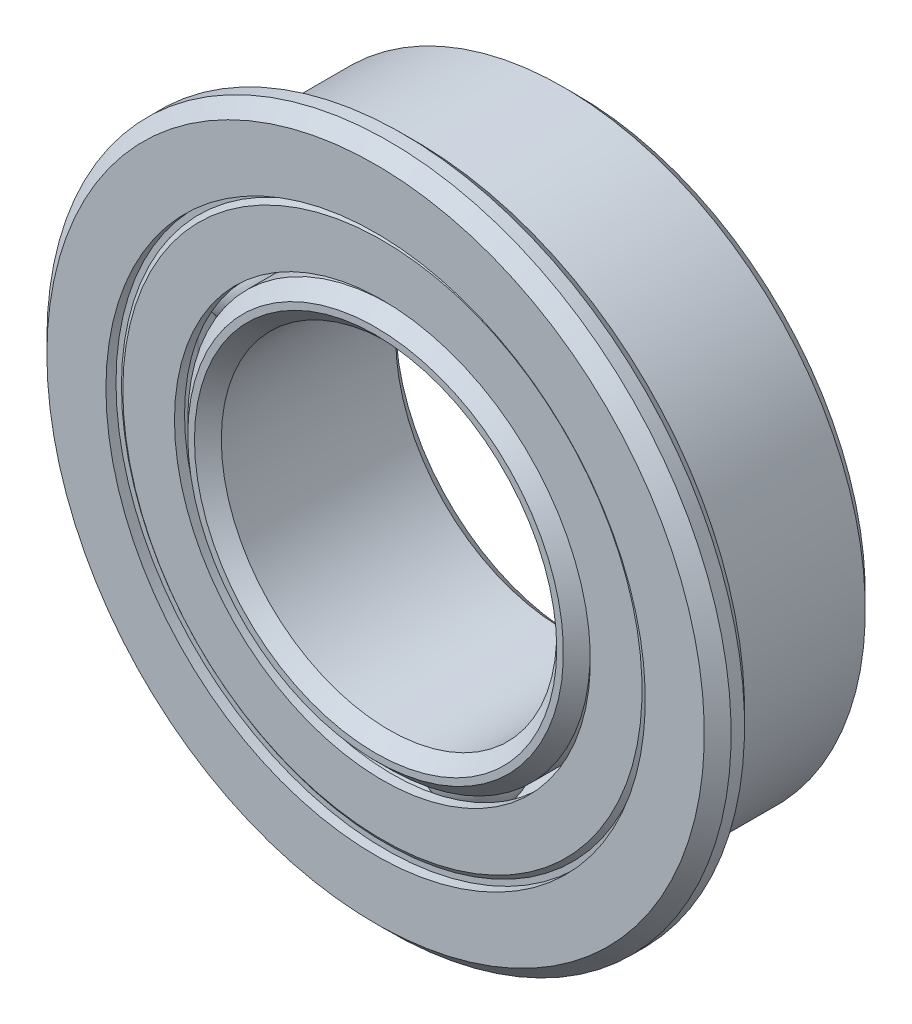
ISO-10303-21;
HEADER;
FILE_DESCRIPTION(('STEP AP214'),'2;1');
FILE_NAME('part.step','',(''),(''),'','','');
FILE_SCHEMA(('AUTOMOTIVE_DESIGN { 1 0 10303 214 1 1 1 1 }'));
ENDSEC;
DATA;
#1=APPLICATION_CONTEXT('core data for automotive mechanical design processes');
#2=APPLICATION_PROTOCOL_DEFINITION('international standard','automotive_design',2000,#1);
#3=PRODUCT_CONTEXT('',#1,'mechanical');
#4=PRODUCT('Part','Part','',(#3));
#5=PRODUCT_RELATED_PRODUCT_CATEGORY('part','',(#4));
#6=PRODUCT_DEFINITION_FORMATION('','',#4);
#7=PRODUCT_DEFINITION_CONTEXT('part definition',#1,'design');
#8=PRODUCT_DEFINITION('design','',#6,#7);
#9=PRODUCT_DEFINITION_SHAPE('','',#8);
#10=(LENGTH_UNIT() NAMED_UNIT(*) SI_UNIT(.MILLI.,.METRE.));
#11=(NAMED_UNIT(*) PLANE_ANGLE_UNIT() SI_UNIT($,.RADIAN.));
#12=(NAMED_UNIT(*) SI_UNIT($,.STERADIAN.) SOLID_ANGLE_UNIT());
#13=UNCERTAINTY_MEASURE_WITH_UNIT(LENGTH_MEASURE(1.E-05),#10,'distance_accuracy_value','');
#14=(GEOMETRIC_REPRESENTATION_CONTEXT(3) GLOBAL_UNCERTAINTY_ASSIGNED_CONTEXT((#13)) GLOBAL_UNIT_ASSIGNED_CONTEXT((#10,
#11,#12)) REPRESENTATION_CONTEXT('',''));
#15=CARTESIAN_POINT('',(0.,0.,0.));
#16=DIRECTION('',(0.,0.,1.));
#17=DIRECTION('',(1.,0.,0.));
#18=AXIS2_PLACEMENT_3D('',#15,#16,#17);
#19=CARTESIAN_POINT('',(0.,3.51,0.));
#20=DIRECTION('',(0.,0.,1.));
#21=DIRECTION('',(0.,1.,0.));
#22=AXIS2_PLACEMENT_3D('',#19,#20,#21);
#23=SPHERICAL_SURFACE('',#22,0.5955);
#24=CARTESIAN_POINT('',(0.,3.51,0.5955));
#25=VERTEX_POINT('',#24);
#26=VERTEX_LOOP('',#25);
#27=FACE_BOUND('',#26,.T.);
#28=ADVANCED_FACE('P0_F13',(#27),#23,.T.);
#29=CLOSED_SHELL('',(#28));
#30=MANIFOLD_SOLID_BREP('P0_B1',#29);
#31=CARTESIAN_POINT('',(2.06312623554658,2.83964965025607,0.));
#32=DIRECTION('',(0.,0.,1.));
#33=DIRECTION('',(0.587785252292474,0.809016994374947,0.));
#34=AXIS2_PLACEMENT_3D('',#31,#32,#33);
#35=SPHERICAL_SURFACE('',#34,0.5955);
#36=CARTESIAN_POINT('',(2.06312623554658,2.83964965025607,0.5955));
#37=VERTEX_POINT('',#36);
#38=VERTEX_LOOP('',#37);
#39=FACE_BOUND('',#38,.T.);
#40=ADVANCED_FACE('P1_F13',(#39),#35,.T.);
#41=CLOSED_SHELL('',(#40));
#42=MANIFOLD_SOLID_BREP('P1_B1',#41);
#43=CARTESIAN_POINT('',(3.33820837219599,1.08464965025606,0.));
#44=DIRECTION('',(0.,0.,1.));
#45=DIRECTION('',(0.951056516295155,0.309016994374945,0.));
#46=AXIS2_PLACEMENT_3D('',#43,#44,#45);
#47=SPHERICAL_SURFACE('',#46,0.5955);
#48=CARTESIAN_POINT('',(3.33820837219599,1.08464965025606,0.5955));
#49=VERTEX_POINT('',#48);
#50=VERTEX_LOOP('',#49);
#51=FACE_BOUND('',#50,.T.);
#52=ADVANCED_FACE('P2_F13',(#51),#47,.T.);
#53=CLOSED_SHELL('',(#52));
#54=MANIFOLD_SOLID_BREP('P2_B1',#53);
#55=CARTESIAN_POINT('',(3.33820837219598,-1.08464965025608,0.));
#56=DIRECTION('',(0.,0.,1.));
#57=DIRECTION('',(0.951056516295152,-0.309016994374952,0.));
#58=AXIS2_PLACEMENT_3D('',#55,#56,#57);
#59=SPHERICAL_SURFACE('',#58,0.5955);
#60=CARTESIAN_POINT('',(3.33820837219598,-1.08464965025608,0.5955));
#61=VERTEX_POINT('',#60);
#62=VERTEX_LOOP('',#61);
#63=FACE_BOUND('',#62,.T.);
#64=ADVANCED_FACE('P3_F13',(#63),#59,.T.);
#65=CLOSED_SHELL('',(#64));
#66=MANIFOLD_SOLID_BREP('P3_B1',#65);
#67=CARTESIAN_POINT('',(2.06312623554656,-2.83964965025608,0.));
#68=DIRECTION('',(0.,0.,1.));
#69=DIRECTION('',(0.587785252292469,-0.809016994374951,0.));
#70=AXIS2_PLACEMENT_3D('',#67,#68,#69);
#71=SPHERICAL_SURFACE('',#70,0.5955);
#72=CARTESIAN_POINT('',(2.06312623554656,-2.83964965025608,0.5955));
#73=VERTEX_POINT('',#72);
#74=VERTEX_LOOP('',#73);
#75=FACE_BOUND('',#74,.T.);
#76=ADVANCED_FACE('P4_F13',(#75),#71,.T.);
#77=CLOSED_SHELL('',(#76));
#78=MANIFOLD_SOLID_BREP('P4_B1',#77);
#79=CARTESIAN_POINT('',(0.,0.,0.));
#80=DIRECTION('',(0.,0.,-1.));
#81=DIRECTION('',(-1.,0.,0.));
#82=AXIS2_PLACEMENT_3D('',#79,#80,#81);
#83=TOROIDAL_SURFACE('',#82,3.51,0.526873164408158);
#84=CARTESIAN_POINT('',(0.,0.,0.132269918626526));
#85=DIRECTION('',(0.,0.,-1.));
#86=DIRECTION('',(-1.,0.,0.));
#87=AXIS2_PLACEMENT_3D('',#84,#85,#86);
#88=CIRCLE('',#87,3.);
#89=CARTESIAN_POINT('',(-3.,0.,0.132269918626526));
#90=VERTEX_POINT('',#89);
#91=EDGE_CURVE('P5_E10',#90,#90,#88,.T.);
#92=ORIENTED_EDGE('',*,*,#91,.T.);
#93=EDGE_LOOP('',(#92));
#94=FACE_BOUND('',#93,.T.);
#95=CARTESIAN_POINT('',(0.,0.,-0.132269918626526));
#96=DIRECTION('',(0.,0.,-1.));
#97=DIRECTION('',(-1.,0.,0.));
#98=AXIS2_PLACEMENT_3D('',#95,#96,#97);
#99=CIRCLE('',#98,3.);
#100=CARTESIAN_POINT('',(-3.,0.,-0.132269918626526));
#101=VERTEX_POINT('',#100);
#102=EDGE_CURVE('P5_E49',#101,#101,#99,.T.);
#103=ORIENTED_EDGE('',*,*,#102,.F.);
#104=EDGE_LOOP('',(#103));
#105=FACE_BOUND('',#104,.T.);
#106=ADVANCED_FACE('P5_F15',(#94,#105),#83,.F.);
#107=CARTESIAN_POINT('',(0.,0.,0.));
#108=DIRECTION('',(0.,0.,-1.));
#109=DIRECTION('',(-1.,0.,0.));
#110=AXIS2_PLACEMENT_3D('',#107,#108,#109);
#111=CYLINDRICAL_SURFACE('',#110,3.);
#112=CARTESIAN_POINT('',(0.,0.,1.3));
#113=DIRECTION('',(0.,0.,-1.));
#114=DIRECTION('',(-1.,0.,0.));
#115=AXIS2_PLACEMENT_3D('',#112,#113,#114);
#116=CIRCLE('',#115,3.);
#117=CARTESIAN_POINT('',(-3.,0.,1.3));
#118=VERTEX_POINT('',#117);
#119=EDGE_CURVE('P5_E21',#118,#118,#116,.T.);
#120=ORIENTED_EDGE('',*,*,#119,.T.);
#121=EDGE_LOOP('',(#120));
#122=FACE_BOUND('',#121,.T.);
#123=ORIENTED_EDGE('',*,*,#91,.F.);
#124=EDGE_LOOP('',(#123));
#125=FACE_BOUND('',#124,.T.);
#126=ADVANCED_FACE('P5_F57',(#122,#125),#111,.T.);
#127=CARTESIAN_POINT('',(0.,0.,1.3));
#128=DIRECTION('',(0.,0.,-1.));
#129=DIRECTION('',(-1.,0.,0.));
#130=AXIS2_PLACEMENT_3D('',#127,#128,#129);
#131=CONICAL_SURFACE('',#130,3.,0.785398163397449);
#132=CARTESIAN_POINT('',(0.,0.,1.5));
#133=DIRECTION('',(0.,0.,-1.));
#134=DIRECTION('',(-1.,0.,0.));
#135=AXIS2_PLACEMENT_3D('',#132,#133,#134);
#136=CIRCLE('',#135,2.8);
#137=CARTESIAN_POINT('',(-2.8,0.,1.5));
#138=VERTEX_POINT('',#137);
#139=EDGE_CURVE('P5_E25',#138,#138,#136,.T.);
#140=ORIENTED_EDGE('',*,*,#139,.T.);
#141=EDGE_LOOP('',(#140));
#142=FACE_BOUND('',#141,.T.);
#143=ORIENTED_EDGE('',*,*,#119,.F.);
#144=EDGE_LOOP('',(#143));
#145=FACE_BOUND('',#144,.T.);
#146=ADVANCED_FACE('P5_F63',(#142,#145),#131,.T.);
#147=CARTESIAN_POINT('',(0.,2.7,1.5));
#148=DIRECTION('',(0.,0.,1.));
#149=DIRECTION('',(1.,0.,0.));
#150=AXIS2_PLACEMENT_3D('',#147,#148,#149);
#151=PLANE('',#150);
#152=CARTESIAN_POINT('',(0.,0.,1.5));
#153=DIRECTION('',(0.,0.,-1.));
#154=DIRECTION('',(-1.,0.,0.));
#155=AXIS2_PLACEMENT_3D('',#152,#153,#154);
#156=CIRCLE('',#155,2.7);
#157=CARTESIAN_POINT('',(-2.7,0.,1.5));
#158=VERTEX_POINT('',#157);
#159=EDGE_CURVE('P5_E29',#158,#158,#156,.T.);
#160=ORIENTED_EDGE('',*,*,#159,.T.);
#161=EDGE_LOOP('',(#160));
#162=FACE_BOUND('',#161,.T.);
#163=ORIENTED_EDGE('',*,*,#139,.F.);
#164=EDGE_LOOP('',(#163));
#165=FACE_BOUND('',#164,.T.);
#166=ADVANCED_FACE('P5_F68',(#162,#165),#151,.T.);
#167=CARTESIAN_POINT('',(0.,0.,1.5));
#168=DIRECTION('',(0.,0.,1.));
#169=DIRECTION('',(1.,0.,0.));
#170=AXIS2_PLACEMENT_3D('',#167,#168,#169);
#171=CONICAL_SURFACE('',#170,2.7,0.785398163397449);
#172=CARTESIAN_POINT('',(0.,0.,1.3));
#173=DIRECTION('',(0.,0.,-1.));
#174=DIRECTION('',(-1.,0.,0.));
#175=AXIS2_PLACEMENT_3D('',#172,#173,#174);
#176=CIRCLE('',#175,2.5);
#177=CARTESIAN_POINT('',(-2.5,0.,1.3));
#178=VERTEX_POINT('',#177);
#179=EDGE_CURVE('P5_E34',#178,#178,#176,.T.);
#180=ORIENTED_EDGE('',*,*,#179,.T.);
#181=EDGE_LOOP('',(#180));
#182=FACE_BOUND('',#181,.T.);
#183=ORIENTED_EDGE('',*,*,#159,.F.);
#184=EDGE_LOOP('',(#183));
#185=FACE_BOUND('',#184,.T.);
#186=ADVANCED_FACE('P5_F75',(#182,#185),#171,.F.);
#187=CARTESIAN_POINT('',(0.,0.,0.));
#188=DIRECTION('',(0.,0.,-1.));
#189=DIRECTION('',(-1.,0.,0.));
#190=AXIS2_PLACEMENT_3D('',#187,#188,#189);
#191=CYLINDRICAL_SURFACE('',#190,2.5);
#192=CARTESIAN_POINT('',(0.,0.,-1.3));
#193=DIRECTION('',(0.,0.,-1.));
#194=DIRECTION('',(-1.,0.,0.));
#195=AXIS2_PLACEMENT_3D('',#192,#193,#194);
#196=CIRCLE('',#195,2.5);
#197=CARTESIAN_POINT('',(-2.5,0.,-1.3));
#198=VERTEX_POINT('',#197);
#199=EDGE_CURVE('P5_E37',#198,#198,#196,.T.);
#200=ORIENTED_EDGE('',*,*,#199,.T.);
#201=EDGE_LOOP('',(#200));
#202=FACE_BOUND('',#201,.T.);
#203=ORIENTED_EDGE('',*,*,#179,.F.);
#204=EDGE_LOOP('',(#203));
#205=FACE_BOUND('',#204,.T.);
#206=ADVANCED_FACE('P5_F79',(#202,#205),#191,.F.);
#207=CARTESIAN_POINT('',(0.,0.,-1.3));
#208=DIRECTION('',(0.,0.,-1.));
#209=DIRECTION('',(-1.,0.,0.));
#210=AXIS2_PLACEMENT_3D('',#207,#208,#209);
#211=CONICAL_SURFACE('',#210,2.5,0.785398163397452);
#212=CARTESIAN_POINT('',(0.,0.,-1.5));
#213=DIRECTION('',(0.,0.,-1.));
#214=DIRECTION('',(-1.,0.,0.));
#215=AXIS2_PLACEMENT_3D('',#212,#213,#214);
#216=CIRCLE('',#215,2.7);
#217=CARTESIAN_POINT('',(-2.7,0.,-1.5));
#218=VERTEX_POINT('',#217);
#219=EDGE_CURVE('P5_E40',#218,#218,#216,.T.);
#220=ORIENTED_EDGE('',*,*,#219,.T.);
#221=EDGE_LOOP('',(#220));
#222=FACE_BOUND('',#221,.T.);
#223=ORIENTED_EDGE('',*,*,#199,.F.);
#224=EDGE_LOOP('',(#223));
#225=FACE_BOUND('',#224,.T.);
#226=ADVANCED_FACE('P5_F83',(#222,#225),#211,.F.);
#227=CARTESIAN_POINT('',(0.,2.8,-1.5));
#228=DIRECTION('',(0.,0.,-1.));
#229=DIRECTION('',(-1.,0.,0.));
#230=AXIS2_PLACEMENT_3D('',#227,#228,#229);
#231=PLANE('',#230);
#232=CARTESIAN_POINT('',(0.,0.,-1.5));
#233=DIRECTION('',(0.,0.,-1.));
#234=DIRECTION('',(-1.,0.,0.));
#235=AXIS2_PLACEMENT_3D('',#232,#233,#234);
#236=CIRCLE('',#235,2.8);
#237=CARTESIAN_POINT('',(-2.8,0.,-1.5));
#238=VERTEX_POINT('',#237);
#239=EDGE_CURVE('P5_E43',#238,#238,#236,.T.);
#240=ORIENTED_EDGE('',*,*,#239,.T.);
#241=EDGE_LOOP('',(#240));
#242=FACE_BOUND('',#241,.T.);
#243=ORIENTED_EDGE('',*,*,#219,.F.);
#244=EDGE_LOOP('',(#243));
#245=FACE_BOUND('',#244,.T.);
#246=ADVANCED_FACE('P5_F87',(#242,#245),#231,.T.);
#247=CARTESIAN_POINT('',(0.,0.,-1.5));
#248=DIRECTION('',(0.,0.,1.));
#249=DIRECTION('',(1.,0.,0.));
#250=AXIS2_PLACEMENT_3D('',#247,#248,#249);
#251=CONICAL_SURFACE('',#250,2.8,0.785398163397449);
#252=CARTESIAN_POINT('',(0.,0.,-1.3));
#253=DIRECTION('',(0.,0.,-1.));
#254=DIRECTION('',(-1.,0.,0.));
#255=AXIS2_PLACEMENT_3D('',#252,#253,#254);
#256=CIRCLE('',#255,3.);
#257=CARTESIAN_POINT('',(-3.,0.,-1.3));
#258=VERTEX_POINT('',#257);
#259=EDGE_CURVE('P5_E46',#258,#258,#256,.T.);
#260=ORIENTED_EDGE('',*,*,#259,.T.);
#261=EDGE_LOOP('',(#260));
#262=FACE_BOUND('',#261,.T.);
#263=ORIENTED_EDGE('',*,*,#239,.F.);
#264=EDGE_LOOP('',(#263));
#265=FACE_BOUND('',#264,.T.);
#266=ADVANCED_FACE('P5_F91',(#262,#265),#251,.T.);
#267=CARTESIAN_POINT('',(0.,0.,0.));
#268=DIRECTION('',(0.,0.,-1.));
#269=DIRECTION('',(-1.,0.,0.));
#270=AXIS2_PLACEMENT_3D('',#267,#268,#269);
#271=CYLINDRICAL_SURFACE('',#270,3.);
#272=ORIENTED_EDGE('',*,*,#102,.T.);
#273=EDGE_LOOP('',(#272));
#274=FACE_BOUND('',#273,.T.);
#275=ORIENTED_EDGE('',*,*,#259,.F.);
#276=EDGE_LOOP('',(#275));
#277=FACE_BOUND('',#276,.T.);
#278=ADVANCED_FACE('P5_F53',(#274,#277),#271,.T.);
#279=CLOSED_SHELL('',(#106,#126,#146,#166,#186,#206,#226,#246,#266,#278));
#280=MANIFOLD_SOLID_BREP('P5_B1',#279);
#281=CARTESIAN_POINT('',(0.,-3.51,0.));
#282=DIRECTION('',(0.,0.,1.));
#283=DIRECTION('',(0.,-1.,0.));
#284=AXIS2_PLACEMENT_3D('',#281,#282,#283);
#285=SPHERICAL_SURFACE('',#284,0.5955);
#286=CARTESIAN_POINT('',(0.,-3.51,0.5955));
#287=VERTEX_POINT('',#286);
#288=VERTEX_LOOP('',#287);
#289=FACE_BOUND('',#288,.T.);
#290=ADVANCED_FACE('P6_F13',(#289),#285,.T.);
#291=CLOSED_SHELL('',(#290));
#292=MANIFOLD_SOLID_BREP('P6_B1',#291);
#293=CARTESIAN_POINT('',(0.,4.02,-1.35));
#294=DIRECTION('',(0.,0.,-1.));
#295=DIRECTION('',(-1.,0.,0.));
#296=AXIS2_PLACEMENT_3D('',#293,#294,#295);
#297=PLANE('',#296);
#298=CARTESIAN_POINT('',(0.,0.,-1.35));
#299=DIRECTION('',(0.,0.,-1.));
#300=DIRECTION('',(-1.,0.,0.));
#301=AXIS2_PLACEMENT_3D('',#298,#299,#300);
#302=CIRCLE('',#301,4.02);
#303=CARTESIAN_POINT('',(-4.02,0.,-1.35));
#304=VERTEX_POINT('',#303);
#305=EDGE_CURVE('P7_E43',#304,#304,#302,.T.);
#306=ORIENTED_EDGE('',*,*,#305,.T.);
#307=EDGE_LOOP('',(#306));
#308=FACE_BOUND('',#307,.T.);
#309=CARTESIAN_POINT('',(0.,0.,-1.35));
#310=DIRECTION('',(0.,0.,-1.));
#311=DIRECTION('',(-1.,0.,0.));
#312=AXIS2_PLACEMENT_3D('',#309,#310,#311);
#313=CIRCLE('',#312,3.93874355173164);
#314=CARTESIAN_POINT('',(-3.93874355173164,0.,-1.35));
#315=VERTEX_POINT('',#314);
#316=EDGE_CURVE('P7_E10',#315,#315,#313,.T.);
#317=ORIENTED_EDGE('',*,*,#316,.F.);
#318=EDGE_LOOP('',(#317));
#319=FACE_BOUND('',#318,.T.);
#320=ADVANCED_FACE('P7_F15',(#308,#319),#297,.T.);
#321=CARTESIAN_POINT('',(0.,0.,-1.3981347531258));
#322=DIRECTION('',(0.,0.,1.));
#323=DIRECTION('',(1.,0.,0.));
#324=AXIS2_PLACEMENT_3D('',#321,#322,#323);
#325=CONICAL_SURFACE('',#324,3.87,0.95993108859688);
#326=ORIENTED_EDGE('',*,*,#316,.T.);
#327=EDGE_LOOP('',(#326));
#328=FACE_BOUND('',#327,.T.);
#329=CARTESIAN_POINT('',(0.,0.,-1.3981347531258));
#330=DIRECTION('',(0.,0.,-1.));
#331=DIRECTION('',(-1.,0.,0.));
#332=AXIS2_PLACEMENT_3D('',#329,#330,#331);
#333=CIRCLE('',#332,3.87);
#334=CARTESIAN_POINT('',(-3.87,0.,-1.3981347531258));
#335=VERTEX_POINT('',#334);
#336=EDGE_CURVE('P7_E21',#335,#335,#333,.T.);
#337=ORIENTED_EDGE('',*,*,#336,.F.);
#338=EDGE_LOOP('',(#337));
#339=FACE_BOUND('',#338,.T.);
#340=ADVANCED_FACE('P7_F63',(#328,#339),#325,.T.);
#341=CARTESIAN_POINT('',(0.,3.87,-1.3981347531258));
#342=DIRECTION('',(0.,0.,-1.));
#343=DIRECTION('',(-1.,0.,0.));
#344=AXIS2_PLACEMENT_3D('',#341,#342,#343);
#345=PLANE('',#344);
#346=ORIENTED_EDGE('',*,*,#336,.T.);
#347=EDGE_LOOP('',(#346));
#348=FACE_BOUND('',#347,.T.);
#349=CARTESIAN_POINT('',(0.,0.,-1.3981347531258));
#350=DIRECTION('',(0.,0.,-1.));
#351=DIRECTION('',(-1.,0.,0.));
#352=AXIS2_PLACEMENT_3D('',#349,#350,#351);
#353=CIRCLE('',#352,3.1);
#354=CARTESIAN_POINT('',(-3.1,0.,-1.3981347531258));
#355=VERTEX_POINT('',#354);
#356=EDGE_CURVE('P7_E25',#355,#355,#353,.T.);
#357=ORIENTED_EDGE('',*,*,#356,.F.);
#358=EDGE_LOOP('',(#357));
#359=FACE_BOUND('',#358,.T.);
#360=ADVANCED_FACE('P7_F68',(#348,#359),#345,.T.);
#361=CARTESIAN_POINT('',(0.,0.,0.));
#362=DIRECTION('',(0.,0.,-1.));
#363=DIRECTION('',(-1.,0.,0.));
#364=AXIS2_PLACEMENT_3D('',#361,#362,#363);
#365=CYLINDRICAL_SURFACE('',#364,3.1);
#366=ORIENTED_EDGE('',*,*,#356,.T.);
#367=EDGE_LOOP('',(#366));
#368=FACE_BOUND('',#367,.T.);
#369=CARTESIAN_POINT('',(0.,0.,-1.2481347531258));
#370=DIRECTION('',(0.,0.,-1.));
#371=DIRECTION('',(-1.,0.,0.));
#372=AXIS2_PLACEMENT_3D('',#369,#370,#371);
#373=CIRCLE('',#372,3.1);
#374=CARTESIAN_POINT('',(-3.1,0.,-1.2481347531258));
#375=VERTEX_POINT('',#374);
#376=EDGE_CURVE('P7_E29',#375,#375,#373,.T.);
#377=ORIENTED_EDGE('',*,*,#376,.F.);
#378=EDGE_LOOP('',(#377));
#379=FACE_BOUND('',#378,.T.);
#380=ADVANCED_FACE('P7_F73',(#368,#379),#365,.F.);
#381=CARTESIAN_POINT('',(0.,3.82270518166815,-1.2481347531258));
#382=DIRECTION('',(0.,0.,1.));
#383=DIRECTION('',(1.,0.,0.));
#384=AXIS2_PLACEMENT_3D('',#381,#382,#383);
#385=PLANE('',#384);
#386=ORIENTED_EDGE('',*,*,#376,.T.);
#387=EDGE_LOOP('',(#386));
#388=FACE_BOUND('',#387,.T.);
#389=CARTESIAN_POINT('',(0.,0.,-1.2481347531258));
#390=DIRECTION('',(0.,0.,-1.));
#391=DIRECTION('',(-1.,0.,0.));
#392=AXIS2_PLACEMENT_3D('',#389,#390,#391);
#393=CIRCLE('',#392,3.82270518166815);
#394=CARTESIAN_POINT('',(-3.82270518166815,0.,-1.2481347531258));
#395=VERTEX_POINT('',#394);
#396=EDGE_CURVE('P7_E34',#395,#395,#393,.T.);
#397=ORIENTED_EDGE('',*,*,#396,.F.);
#398=EDGE_LOOP('',(#397));
#399=FACE_BOUND('',#398,.T.);
#400=ADVANCED_FACE('P7_F79',(#388,#399),#385,.T.);
#401=CARTESIAN_POINT('',(0.,0.,-1.21501856481158));
#402=DIRECTION('',(0.,0.,1.));
#403=DIRECTION('',(1.,0.,0.));
#404=AXIS2_PLACEMENT_3D('',#401,#402,#403);
#405=CONICAL_SURFACE('',#404,3.87,0.959931088596887);
#406=ORIENTED_EDGE('',*,*,#396,.T.);
#407=EDGE_LOOP('',(#406));
#408=FACE_BOUND('',#407,.T.);
#409=CARTESIAN_POINT('',(0.,0.,-1.21501856481158));
#410=DIRECTION('',(0.,0.,-1.));
#411=DIRECTION('',(-1.,0.,0.));
#412=AXIS2_PLACEMENT_3D('',#409,#410,#411);
#413=CIRCLE('',#412,3.87);
#414=CARTESIAN_POINT('',(-3.87,0.,-1.21501856481158));
#415=VERTEX_POINT('',#414);
#416=EDGE_CURVE('P7_E37',#415,#415,#413,.T.);
#417=ORIENTED_EDGE('',*,*,#416,.F.);
#418=EDGE_LOOP('',(#417));
#419=FACE_BOUND('',#418,.T.);
#420=ADVANCED_FACE('P7_F59',(#408,#419),#405,.F.);
#421=CARTESIAN_POINT('',(0.,3.87,-1.21501856481158));
#422=DIRECTION('',(0.,0.,1.));
#423=DIRECTION('',(1.,0.,0.));
#424=AXIS2_PLACEMENT_3D('',#421,#422,#423);
#425=PLANE('',#424);
#426=ORIENTED_EDGE('',*,*,#416,.T.);
#427=EDGE_LOOP('',(#426));
#428=FACE_BOUND('',#427,.T.);
#429=CARTESIAN_POINT('',(0.,0.,-1.21501856481158));
#430=DIRECTION('',(0.,0.,-1.));
#431=DIRECTION('',(-1.,0.,0.));
#432=AXIS2_PLACEMENT_3D('',#429,#430,#431);
#433=CIRCLE('',#432,4.02);
#434=CARTESIAN_POINT('',(-4.02,0.,-1.21501856481158));
#435=VERTEX_POINT('',#434);
#436=EDGE_CURVE('P7_E40',#435,#435,#433,.T.);
#437=ORIENTED_EDGE('',*,*,#436,.F.);
#438=EDGE_LOOP('',(#437));
#439=FACE_BOUND('',#438,.T.);
#440=ADVANCED_FACE('P7_F51',(#428,#439),#425,.T.);
#441=CARTESIAN_POINT('',(0.,0.,0.));
#442=DIRECTION('',(0.,0.,-1.));
#443=DIRECTION('',(-1.,0.,0.));
#444=AXIS2_PLACEMENT_3D('',#441,#442,#443);
#445=CYLINDRICAL_SURFACE('',#444,4.02);
#446=ORIENTED_EDGE('',*,*,#436,.T.);
#447=EDGE_LOOP('',(#446));
#448=FACE_BOUND('',#447,.T.);
#449=ORIENTED_EDGE('',*,*,#305,.F.);
#450=EDGE_LOOP('',(#449));
#451=FACE_BOUND('',#450,.T.);
#452=ADVANCED_FACE('P7_F49',(#448,#451),#445,.T.);
#453=CLOSED_SHELL('',(#320,#340,#360,#380,#400,#420,#440,#452));
#454=MANIFOLD_SOLID_BREP('P7_B1',#453);
#455=CARTESIAN_POINT('',(-2.0631262355466,-2.83964965025605,0.));
#456=DIRECTION('',(0.,0.,1.));
#457=DIRECTION('',(-0.58778525229248,-0.809016994374942,0.));
#458=AXIS2_PLACEMENT_3D('',#455,#456,#457);
#459=SPHERICAL_SURFACE('',#458,0.5955);
#460=CARTESIAN_POINT('',(-2.0631262355466,-2.83964965025605,0.5955));
#461=VERTEX_POINT('',#460);
#462=VERTEX_LOOP('',#461);
#463=FACE_BOUND('',#462,.T.);
#464=ADVANCED_FACE('P8_F13',(#463),#459,.T.);
#465=CLOSED_SHELL('',(#464));
#466=MANIFOLD_SOLID_BREP('P8_B1',#465);
#467=CARTESIAN_POINT('',(0.,0.,0.));
#468=DIRECTION('',(0.,0.,-1.));
#469=DIRECTION('',(-1.,0.,0.));
#470=AXIS2_PLACEMENT_3D('',#467,#468,#469);
#471=TOROIDAL_SURFACE('',#470,3.51,0.526873164408158);
#472=CARTESIAN_POINT('',(0.,0.,-0.132269918626519));
#473=DIRECTION('',(0.,0.,-1.));
#474=DIRECTION('',(-1.,0.,0.));
#475=AXIS2_PLACEMENT_3D('',#472,#473,#474);
#476=CIRCLE('',#475,4.02);
#477=CARTESIAN_POINT('',(-4.02,0.,-0.132269918626519));
#478=VERTEX_POINT('',#477);
#479=EDGE_CURVE('P9_E18',#478,#478,#476,.T.);
#480=ORIENTED_EDGE('',*,*,#479,.T.);
#481=EDGE_LOOP('',(#480));
#482=FACE_BOUND('',#481,.T.);
#483=CARTESIAN_POINT('',(0.,0.,0.132269918626519));
#484=DIRECTION('',(0.,0.,-1.));
#485=DIRECTION('',(-1.,0.,0.));
#486=AXIS2_PLACEMENT_3D('',#483,#484,#485);
#487=CIRCLE('',#486,4.02);
#488=CARTESIAN_POINT('',(-4.02,0.,0.132269918626519));
#489=VERTEX_POINT('',#488);
#490=EDGE_CURVE('P9_E31',#489,#489,#487,.T.);
#491=ORIENTED_EDGE('',*,*,#490,.F.);
#492=EDGE_LOOP('',(#491));
#493=FACE_BOUND('',#492,.T.);
#494=ADVANCED_FACE('P9_F15',(#482,#493),#471,.F.);
#495=CARTESIAN_POINT('',(0.,0.,0.));
#496=DIRECTION('',(0.,0.,-1.));
#497=DIRECTION('',(-1.,0.,0.));
#498=AXIS2_PLACEMENT_3D('',#495,#496,#497);
#499=CYLINDRICAL_SURFACE('',#498,4.02);
#500=CARTESIAN_POINT('',(0.,0.,-1.3));
#501=DIRECTION('',(0.,0.,-1.));
#502=DIRECTION('',(-1.,0.,0.));
#503=AXIS2_PLACEMENT_3D('',#500,#501,#502);
#504=CIRCLE('',#503,4.02);
#505=CARTESIAN_POINT('',(-4.02,0.,-1.3));
#506=VERTEX_POINT('',#505);
#507=EDGE_CURVE('P9_E26',#506,#506,#504,.T.);
#508=ORIENTED_EDGE('',*,*,#507,.T.);
#509=EDGE_LOOP('',(#508));
#510=FACE_BOUND('',#509,.T.);
#511=ORIENTED_EDGE('',*,*,#479,.F.);
#512=EDGE_LOOP('',(#511));
#513=FACE_BOUND('',#512,.T.);
#514=ADVANCED_FACE('P9_F45',(#510,#513),#499,.F.);
#515=CARTESIAN_POINT('',(0.,0.,-1.3));
#516=DIRECTION('',(0.,0.,-1.));
#517=DIRECTION('',(-1.,0.,0.));
#518=AXIS2_PLACEMENT_3D('',#515,#516,#517);
#519=CONICAL_SURFACE('',#518,4.02,0.785398163397448);
#520=CARTESIAN_POINT('',(0.,0.,-1.5));
#521=DIRECTION('',(0.,0.,-1.));
#522=DIRECTION('',(-1.,0.,0.));
#523=AXIS2_PLACEMENT_3D('',#520,#521,#522);
#524=CIRCLE('',#523,4.22);
#525=CARTESIAN_POINT('',(-4.22,0.,-1.5));
#526=VERTEX_POINT('',#525);
#527=EDGE_CURVE('P9_E40',#526,#526,#524,.T.);
#528=ORIENTED_EDGE('',*,*,#527,.T.);
#529=EDGE_LOOP('',(#528));
#530=FACE_BOUND('',#529,.T.);
#531=ORIENTED_EDGE('',*,*,#507,.F.);
#532=EDGE_LOOP('',(#531));
#533=FACE_BOUND('',#532,.T.);
#534=ADVANCED_FACE('P9_F48',(#530,#533),#519,.F.);
#535=CARTESIAN_POINT('',(0.,4.22,-1.5));
#536=DIRECTION('',(0.,0.,-1.));
#537=DIRECTION('',(-1.,0.,0.));
#538=AXIS2_PLACEMENT_3D('',#535,#536,#537);
#539=PLANE('',#538);
#540=CARTESIAN_POINT('',(0.,0.,-1.5));
#541=DIRECTION('',(0.,0.,-1.));
#542=DIRECTION('',(-1.,0.,0.));
#543=AXIS2_PLACEMENT_3D('',#540,#541,#542);
#544=CIRCLE('',#543,4.3);
#545=CARTESIAN_POINT('',(-4.3,0.,-1.5));
#546=VERTEX_POINT('',#545);
#547=EDGE_CURVE('P9_E37',#546,#546,#544,.T.);
#548=ORIENTED_EDGE('',*,*,#547,.T.);
#549=EDGE_LOOP('',(#548));
#550=FACE_BOUND('',#549,.T.);
#551=ORIENTED_EDGE('',*,*,#527,.F.);
#552=EDGE_LOOP('',(#551));
#553=FACE_BOUND('',#552,.T.);
#554=ADVANCED_FACE('P9_F50',(#550,#553),#539,.T.);
#555=CARTESIAN_POINT('',(0.,0.,-1.5));
#556=DIRECTION('',(0.,0.,1.));
#557=DIRECTION('',(1.,0.,0.));
#558=AXIS2_PLACEMENT_3D('',#555,#556,#557);
#559=CONICAL_SURFACE('',#558,4.3,0.785398163397445);
#560=CARTESIAN_POINT('',(0.,0.,-1.3));
#561=DIRECTION('',(0.,0.,-1.));
#562=DIRECTION('',(-1.,0.,0.));
#563=AXIS2_PLACEMENT_3D('',#560,#561,#562);
#564=CIRCLE('',#563,4.5);
#565=CARTESIAN_POINT('',(-4.5,0.,-1.3));
#566=VERTEX_POINT('',#565);
#567=EDGE_CURVE('P9_E34',#566,#566,#564,.T.);
#568=ORIENTED_EDGE('',*,*,#567,.T.);
#569=EDGE_LOOP('',(#568));
#570=FACE_BOUND('',#569,.T.);
#571=ORIENTED_EDGE('',*,*,#547,.F.);
#572=EDGE_LOOP('',(#571));
#573=FACE_BOUND('',#572,.T.);
#574=ADVANCED_FACE('P9_F59',(#570,#573),#559,.T.);
#575=CARTESIAN_POINT('',(0.,0.,0.));
#576=DIRECTION('',(0.,0.,-1.));
#577=DIRECTION('',(-1.,0.,0.));
#578=AXIS2_PLACEMENT_3D('',#575,#576,#577);
#579=CYLINDRICAL_SURFACE('',#578,4.5);
#580=CARTESIAN_POINT('',(0.,0.,0.9));
#581=DIRECTION('',(0.,0.,-1.));
#582=DIRECTION('',(-1.,0.,0.));
#583=AXIS2_PLACEMENT_3D('',#580,#581,#582);
#584=CIRCLE('',#583,4.5);
#585=CARTESIAN_POINT('',(-4.5,0.,0.9));
#586=VERTEX_POINT('',#585);
#587=EDGE_CURVE('P9_E10',#586,#586,#584,.F.);
#588=ORIENTED_EDGE('',*,*,#587,.F.);
#589=EDGE_LOOP('',(#588));
#590=FACE_BOUND('',#589,.T.);
#591=ORIENTED_EDGE('',*,*,#567,.F.);
#592=EDGE_LOOP('',(#591));
#593=FACE_BOUND('',#592,.T.);
#594=ADVANCED_FACE('P9_F75',(#590,#593),#579,.T.);
#595=CARTESIAN_POINT('',(0.,0.,0.));
#596=DIRECTION('',(0.,0.,-1.));
#597=DIRECTION('',(-1.,0.,0.));
#598=AXIS2_PLACEMENT_3D('',#595,#596,#597);
#599=CYLINDRICAL_SURFACE('',#598,4.02);
#600=ORIENTED_EDGE('',*,*,#490,.T.);
#601=EDGE_LOOP('',(#600));
#602=FACE_BOUND('',#601,.T.);
#603=CARTESIAN_POINT('',(0.,0.,1.5));
#604=DIRECTION('',(0.,0.,-1.));
#605=DIRECTION('',(-1.,0.,0.));
#606=AXIS2_PLACEMENT_3D('',#603,#604,#605);
#607=CIRCLE('',#606,4.02);
#608=CARTESIAN_POINT('',(-4.02,0.,1.5));
#609=VERTEX_POINT('',#608);
#610=EDGE_CURVE('P9_E29',#609,#609,#607,.T.);
#611=ORIENTED_EDGE('',*,*,#610,.F.);
#612=EDGE_LOOP('',(#611));
#613=FACE_BOUND('',#612,.T.);
#614=ADVANCED_FACE('P9_F71',(#602,#613),#599,.F.);
#615=CARTESIAN_POINT('',(0.,0.,1.3));
#616=DIRECTION('',(0.,0.,-1.));
#617=DIRECTION('',(-1.,0.,0.));
#618=AXIS2_PLACEMENT_3D('',#615,#616,#617);
#619=CONICAL_SURFACE('',#618,5.1,0.785398163397449);
#620=CARTESIAN_POINT('',(0.,0.,1.5));
#621=DIRECTION('',(0.,0.,-1.));
#622=DIRECTION('',(-1.,0.,0.));
#623=AXIS2_PLACEMENT_3D('',#620,#621,#622);
#624=CIRCLE('',#623,4.9);
#625=CARTESIAN_POINT('',(-4.9,0.,1.5));
#626=VERTEX_POINT('',#625);
#627=EDGE_CURVE('P9_E80',#626,#626,#624,.T.);
#628=ORIENTED_EDGE('',*,*,#627,.T.);
#629=EDGE_LOOP('',(#628));
#630=FACE_BOUND('',#629,.T.);
#631=CARTESIAN_POINT('',(0.,0.,1.3));
#632=DIRECTION('',(0.,0.,-1.));
#633=DIRECTION('',(-1.,0.,0.));
#634=AXIS2_PLACEMENT_3D('',#631,#632,#633);
#635=CIRCLE('',#634,5.1);
#636=CARTESIAN_POINT('',(-5.1,0.,1.3));
#637=VERTEX_POINT('',#636);
#638=EDGE_CURVE('P9_E82',#637,#637,#635,.T.);
#639=ORIENTED_EDGE('',*,*,#638,.F.);
#640=EDGE_LOOP('',(#639));
#641=FACE_BOUND('',#640,.T.);
#642=ADVANCED_FACE('P9_F74',(#630,#641),#619,.T.);
#643=CARTESIAN_POINT('',(0.,0.,0.));
#644=DIRECTION('',(0.,0.,-1.));
#645=DIRECTION('',(-1.,0.,0.));
#646=AXIS2_PLACEMENT_3D('',#643,#644,#645);
#647=CYLINDRICAL_SURFACE('',#646,5.1);
#648=ORIENTED_EDGE('',*,*,#638,.T.);
#649=EDGE_LOOP('',(#648));
#650=FACE_BOUND('',#649,.T.);
#651=CARTESIAN_POINT('',(0.,0.,1.1));
#652=DIRECTION('',(0.,0.,-1.));
#653=DIRECTION('',(-1.,0.,0.));
#654=AXIS2_PLACEMENT_3D('',#651,#652,#653);
#655=CIRCLE('',#654,5.1);
#656=CARTESIAN_POINT('',(-5.1,0.,1.1));
#657=VERTEX_POINT('',#656);
#658=EDGE_CURVE('P9_E86',#657,#657,#655,.T.);
#659=ORIENTED_EDGE('',*,*,#658,.F.);
#660=EDGE_LOOP('',(#659));
#661=FACE_BOUND('',#660,.T.);
#662=ADVANCED_FACE('P9_F99',(#650,#661),#647,.T.);
#663=CARTESIAN_POINT('',(0.,0.,0.9));
#664=DIRECTION('',(0.,0.,1.));
#665=DIRECTION('',(1.,0.,0.));
#666=AXIS2_PLACEMENT_3D('',#663,#664,#665);
#667=CONICAL_SURFACE('',#666,4.9,0.785398163397445);
#668=ORIENTED_EDGE('',*,*,#658,.T.);
#669=EDGE_LOOP('',(#668));
#670=FACE_BOUND('',#669,.T.);
#671=CARTESIAN_POINT('',(0.,0.,0.9));
#672=DIRECTION('',(0.,0.,-1.));
#673=DIRECTION('',(-1.,0.,0.));
#674=AXIS2_PLACEMENT_3D('',#671,#672,#673);
#675=CIRCLE('',#674,4.9);
#676=CARTESIAN_POINT('',(-4.9,0.,0.9));
#677=VERTEX_POINT('',#676);
#678=EDGE_CURVE('P9_E91',#677,#677,#675,.T.);
#679=ORIENTED_EDGE('',*,*,#678,.F.);
#680=EDGE_LOOP('',(#679));
#681=FACE_BOUND('',#680,.T.);
#682=ADVANCED_FACE('P9_F97',(#670,#681),#667,.T.);
#683=CARTESIAN_POINT('',(0.,4.9,0.9));
#684=DIRECTION('',(0.,0.,-1.));
#685=DIRECTION('',(-1.,0.,0.));
#686=AXIS2_PLACEMENT_3D('',#683,#684,#685);
#687=PLANE('',#686);
#688=ORIENTED_EDGE('',*,*,#587,.T.);
#689=EDGE_LOOP('',(#688));
#690=FACE_BOUND('',#689,.T.);
#691=ORIENTED_EDGE('',*,*,#678,.T.);
#692=EDGE_LOOP('',(#691));
#693=FACE_BOUND('',#692,.T.);
#694=ADVANCED_FACE('P9_F95',(#690,#693),#687,.T.);
#695=CARTESIAN_POINT('',(0.,4.3,1.5));
#696=DIRECTION('',(0.,0.,1.));
#697=DIRECTION('',(1.,0.,0.));
#698=AXIS2_PLACEMENT_3D('',#695,#696,#697);
#699=PLANE('',#698);
#700=ORIENTED_EDGE('',*,*,#610,.T.);
#701=EDGE_LOOP('',(#700));
#702=FACE_BOUND('',#701,.T.);
#703=ORIENTED_EDGE('',*,*,#627,.F.);
#704=EDGE_LOOP('',(#703));
#705=FACE_BOUND('',#704,.T.);
#706=ADVANCED_FACE('P9_F107',(#702,#705),#699,.T.);
#707=CLOSED_SHELL('',(#494,#514,#534,#554,#574,#594,#614,#642,#662,#682,#694,#706));
#708=MANIFOLD_SOLID_BREP('P9_B1',#707);
#709=CARTESIAN_POINT('',(-3.338208372196,-1.08464965025603,0.));
#710=DIRECTION('',(0.,0.,1.));
#711=DIRECTION('',(-0.951056516295157,-0.309016994374939,0.));
#712=AXIS2_PLACEMENT_3D('',#709,#710,#711);
#713=SPHERICAL_SURFACE('',#712,0.5955);
#714=CARTESIAN_POINT('',(-3.338208372196,-1.08464965025603,0.5955));
#715=VERTEX_POINT('',#714);
#716=VERTEX_LOOP('',#715);
#717=FACE_BOUND('',#716,.T.);
#718=ADVANCED_FACE('P10_F13',(#717),#713,.T.);
#719=CLOSED_SHELL('',(#718));
#720=MANIFOLD_SOLID_BREP('P10_B1',#719);
#721=CARTESIAN_POINT('',(-2.06312623554654,2.83964965025609,0.));
#722=DIRECTION('',(0.,0.,1.));
#723=DIRECTION('',(-0.587785252292463,0.809016994374955,0.));
#724=AXIS2_PLACEMENT_3D('',#721,#722,#723);
#725=SPHERICAL_SURFACE('',#724,0.5955);
#726=CARTESIAN_POINT('',(-2.06312623554654,2.83964965025609,0.5955));
#727=VERTEX_POINT('',#726);
#728=VERTEX_LOOP('',#727);
#729=FACE_BOUND('',#728,.T.);
#730=ADVANCED_FACE('P11_F13',(#729),#725,.T.);
#731=CLOSED_SHELL('',(#730));
#732=MANIFOLD_SOLID_BREP('P11_B1',#731);
#733=CARTESIAN_POINT('',(-3.33820837219598,1.0846496502561,0.));
#734=DIRECTION('',(0.,0.,1.));
#735=DIRECTION('',(-0.95105651629515,0.309016994374958,0.));
#736=AXIS2_PLACEMENT_3D('',#733,#734,#735);
#737=SPHERICAL_SURFACE('',#736,0.5955);
#738=CARTESIAN_POINT('',(-3.33820837219598,1.0846496502561,0.5955));
#739=VERTEX_POINT('',#738);
#740=VERTEX_LOOP('',#739);
#741=FACE_BOUND('',#740,.T.);
#742=ADVANCED_FACE('P12_F13',(#741),#737,.T.);
#743=CLOSED_SHELL('',(#742));
#744=MANIFOLD_SOLID_BREP('P12_B1',#743);
#745=CARTESIAN_POINT('',(0.,3.87,1.21501856481158));
#746=DIRECTION('',(0.,0.,-1.));
#747=DIRECTION('',(-1.,0.,0.));
#748=AXIS2_PLACEMENT_3D('',#745,#746,#747);
#749=PLANE('',#748);
#750=CARTESIAN_POINT('',(0.,0.,1.21501856481158));
#751=DIRECTION('',(0.,0.,-1.));
#752=DIRECTION('',(-1.,0.,0.));
#753=AXIS2_PLACEMENT_3D('',#750,#751,#752);
#754=CIRCLE('',#753,4.02);
#755=CARTESIAN_POINT('',(-4.02,0.,1.21501856481158));
#756=VERTEX_POINT('',#755);
#757=EDGE_CURVE('P13_E43',#756,#756,#754,.T.);
#758=ORIENTED_EDGE('',*,*,#757,.T.);
#759=EDGE_LOOP('',(#758));
#760=FACE_BOUND('',#759,.T.);
#761=CARTESIAN_POINT('',(0.,0.,1.21501856481158));
#762=DIRECTION('',(0.,0.,-1.));
#763=DIRECTION('',(-1.,0.,0.));
#764=AXIS2_PLACEMENT_3D('',#761,#762,#763);
#765=CIRCLE('',#764,3.87);
#766=CARTESIAN_POINT('',(-3.87,0.,1.21501856481158));
#767=VERTEX_POINT('',#766);
#768=EDGE_CURVE('P13_E10',#767,#767,#765,.T.);
#769=ORIENTED_EDGE('',*,*,#768,.F.);
#770=EDGE_LOOP('',(#769));
#771=FACE_BOUND('',#770,.T.);
#772=ADVANCED_FACE('P13_F15',(#760,#771),#749,.T.);
#773=CARTESIAN_POINT('',(0.,0.,1.2481347531258));
#774=DIRECTION('',(0.,0.,-1.));
#775=DIRECTION('',(-1.,0.,0.));
#776=AXIS2_PLACEMENT_3D('',#773,#774,#775);
#777=CONICAL_SURFACE('',#776,3.82270518166815,0.959931088596887);
#778=ORIENTED_EDGE('',*,*,#768,.T.);
#779=EDGE_LOOP('',(#778));
#780=FACE_BOUND('',#779,.T.);
#781=CARTESIAN_POINT('',(0.,0.,1.2481347531258));
#782=DIRECTION('',(0.,0.,-1.));
#783=DIRECTION('',(-1.,0.,0.));
#784=AXIS2_PLACEMENT_3D('',#781,#782,#783);
#785=CIRCLE('',#784,3.82270518166815);
#786=CARTESIAN_POINT('',(-3.82270518166815,0.,1.2481347531258));
#787=VERTEX_POINT('',#786);
#788=EDGE_CURVE('P13_E21',#787,#787,#785,.T.);
#789=ORIENTED_EDGE('',*,*,#788,.F.);
#790=EDGE_LOOP('',(#789));
#791=FACE_BOUND('',#790,.T.);
#792=ADVANCED_FACE('P13_F63',(#780,#791),#777,.F.);
#793=CARTESIAN_POINT('',(0.,3.82270518166815,1.2481347531258));
#794=DIRECTION('',(0.,0.,-1.));
#795=DIRECTION('',(-1.,0.,0.));
#796=AXIS2_PLACEMENT_3D('',#793,#794,#795);
#797=PLANE('',#796);
#798=ORIENTED_EDGE('',*,*,#788,.T.);
#799=EDGE_LOOP('',(#798));
#800=FACE_BOUND('',#799,.T.);
#801=CARTESIAN_POINT('',(0.,0.,1.2481347531258));
#802=DIRECTION('',(0.,0.,-1.));
#803=DIRECTION('',(-1.,0.,0.));
#804=AXIS2_PLACEMENT_3D('',#801,#802,#803);
#805=CIRCLE('',#804,3.1);
#806=CARTESIAN_POINT('',(-3.1,0.,1.2481347531258));
#807=VERTEX_POINT('',#806);
#808=EDGE_CURVE('P13_E25',#807,#807,#805,.T.);
#809=ORIENTED_EDGE('',*,*,#808,.F.);
#810=EDGE_LOOP('',(#809));
#811=FACE_BOUND('',#810,.T.);
#812=ADVANCED_FACE('P13_F68',(#800,#811),#797,.T.);
#813=CARTESIAN_POINT('',(0.,0.,0.));
#814=DIRECTION('',(0.,0.,-1.));
#815=DIRECTION('',(-1.,0.,0.));
#816=AXIS2_PLACEMENT_3D('',#813,#814,#815);
#817=CYLINDRICAL_SURFACE('',#816,3.1);
#818=ORIENTED_EDGE('',*,*,#808,.T.);
#819=EDGE_LOOP('',(#818));
#820=FACE_BOUND('',#819,.T.);
#821=CARTESIAN_POINT('',(0.,0.,1.3981347531258));
#822=DIRECTION('',(0.,0.,-1.));
#823=DIRECTION('',(-1.,0.,0.));
#824=AXIS2_PLACEMENT_3D('',#821,#822,#823);
#825=CIRCLE('',#824,3.1);
#826=CARTESIAN_POINT('',(-3.1,0.,1.3981347531258));
#827=VERTEX_POINT('',#826);
#828=EDGE_CURVE('P13_E29',#827,#827,#825,.T.);
#829=ORIENTED_EDGE('',*,*,#828,.F.);
#830=EDGE_LOOP('',(#829));
#831=FACE_BOUND('',#830,.T.);
#832=ADVANCED_FACE('P13_F73',(#820,#831),#817,.F.);
#833=CARTESIAN_POINT('',(0.,3.87,1.3981347531258));
#834=DIRECTION('',(0.,0.,1.));
#835=DIRECTION('',(1.,0.,0.));
#836=AXIS2_PLACEMENT_3D('',#833,#834,#835);
#837=PLANE('',#836);
#838=ORIENTED_EDGE('',*,*,#828,.T.);
#839=EDGE_LOOP('',(#838));
#840=FACE_BOUND('',#839,.T.);
#841=CARTESIAN_POINT('',(0.,0.,1.3981347531258));
#842=DIRECTION('',(0.,0.,-1.));
#843=DIRECTION('',(-1.,0.,0.));
#844=AXIS2_PLACEMENT_3D('',#841,#842,#843);
#845=CIRCLE('',#844,3.87);
#846=CARTESIAN_POINT('',(-3.87,0.,1.3981347531258));
#847=VERTEX_POINT('',#846);
#848=EDGE_CURVE('P13_E34',#847,#847,#845,.T.);
#849=ORIENTED_EDGE('',*,*,#848,.F.);
#850=EDGE_LOOP('',(#849));
#851=FACE_BOUND('',#850,.T.);
#852=ADVANCED_FACE('P13_F79',(#840,#851),#837,.T.);
#853=CARTESIAN_POINT('',(0.,0.,1.35));
#854=DIRECTION('',(0.,0.,-1.));
#855=DIRECTION('',(-1.,0.,0.));
#856=AXIS2_PLACEMENT_3D('',#853,#854,#855);
#857=CONICAL_SURFACE('',#856,3.93874355173164,0.95993108859688);
#858=ORIENTED_EDGE('',*,*,#848,.T.);
#859=EDGE_LOOP('',(#858));
#860=FACE_BOUND('',#859,.T.);
#861=CARTESIAN_POINT('',(0.,0.,1.35));
#862=DIRECTION('',(0.,0.,-1.));
#863=DIRECTION('',(-1.,0.,0.));
#864=AXIS2_PLACEMENT_3D('',#861,#862,#863);
#865=CIRCLE('',#864,3.93874355173164);
#866=CARTESIAN_POINT('',(-3.93874355173164,0.,1.35));
#867=VERTEX_POINT('',#866);
#868=EDGE_CURVE('P13_E37',#867,#867,#865,.T.);
#869=ORIENTED_EDGE('',*,*,#868,.F.);
#870=EDGE_LOOP('',(#869));
#871=FACE_BOUND('',#870,.T.);
#872=ADVANCED_FACE('P13_F59',(#860,#871),#857,.T.);
#873=CARTESIAN_POINT('',(0.,4.02,1.35));
#874=DIRECTION('',(0.,0.,1.));
#875=DIRECTION('',(1.,0.,0.));
#876=AXIS2_PLACEMENT_3D('',#873,#874,#875);
#877=PLANE('',#876);
#878=ORIENTED_EDGE('',*,*,#868,.T.);
#879=EDGE_LOOP('',(#878));
#880=FACE_BOUND('',#879,.T.);
#881=CARTESIAN_POINT('',(0.,0.,1.35));
#882=DIRECTION('',(0.,0.,-1.));
#883=DIRECTION('',(-1.,0.,0.));
#884=AXIS2_PLACEMENT_3D('',#881,#882,#883);
#885=CIRCLE('',#884,4.02);
#886=CARTESIAN_POINT('',(-4.02,0.,1.35));
#887=VERTEX_POINT('',#886);
#888=EDGE_CURVE('P13_E40',#887,#887,#885,.T.);
#889=ORIENTED_EDGE('',*,*,#888,.F.);
#890=EDGE_LOOP('',(#889));
#891=FACE_BOUND('',#890,.T.);
#892=ADVANCED_FACE('P13_F51',(#880,#891),#877,.T.);
#893=CARTESIAN_POINT('',(0.,0.,0.));
#894=DIRECTION('',(0.,0.,-1.));
#895=DIRECTION('',(-1.,0.,0.));
#896=AXIS2_PLACEMENT_3D('',#893,#894,#895);
#897=CYLINDRICAL_SURFACE('',#896,4.02);
#898=ORIENTED_EDGE('',*,*,#888,.T.);
#899=EDGE_LOOP('',(#898));
#900=FACE_BOUND('',#899,.T.);
#901=ORIENTED_EDGE('',*,*,#757,.F.);
#902=EDGE_LOOP('',(#901));
#903=FACE_BOUND('',#902,.T.);
#904=ADVANCED_FACE('P13_F49',(#900,#903),#897,.T.);
#905=CLOSED_SHELL('',(#772,#792,#812,#832,#852,#872,#892,#904));
#906=MANIFOLD_SOLID_BREP('P13_B1',#905);
#907=ADVANCED_BREP_SHAPE_REPRESENTATION('',(#18,#30,#42,#54,#66,#78,#280,#292,#454,#466,#708,
#720,#732,#744,#906),#14);
#908=SHAPE_DEFINITION_REPRESENTATION(#9,#907);
ENDSEC;
END-ISO-10303-21;
